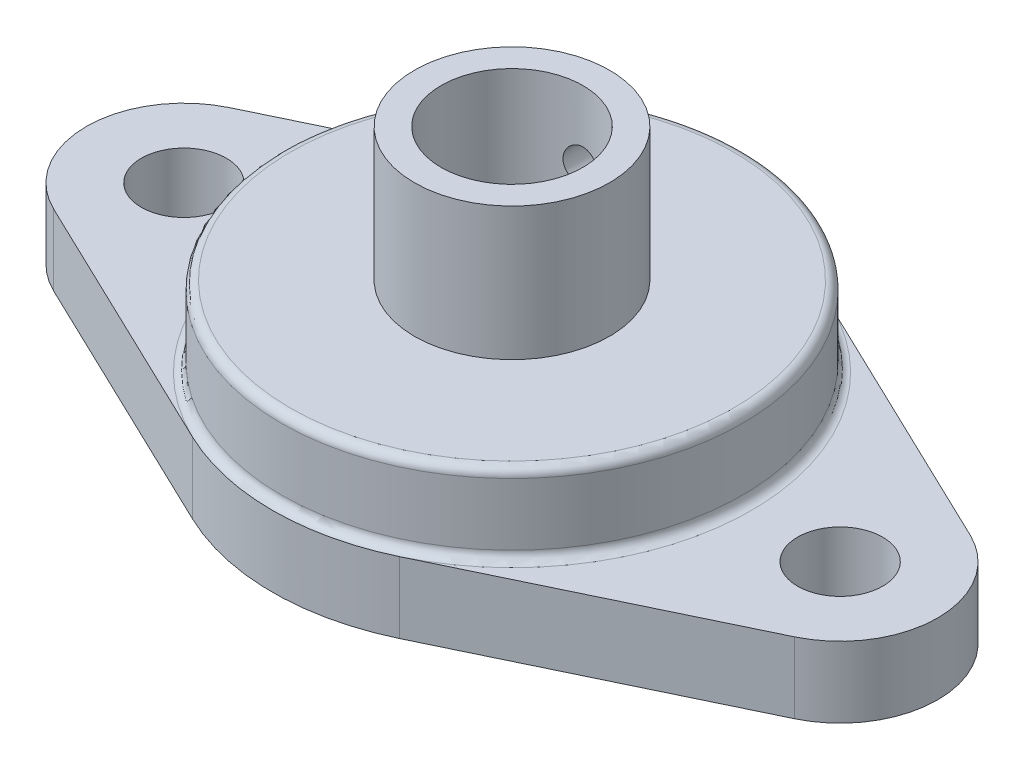
ISO-10303-21;
HEADER;
FILE_DESCRIPTION(('STEP AP214'),'2;1');
FILE_NAME('part.step','',(''),(''),'','','');
FILE_SCHEMA(('AUTOMOTIVE_DESIGN { 1 0 10303 214 1 1 1 1 }'));
ENDSEC;
DATA;
#1=APPLICATION_CONTEXT('core data for automotive mechanical design processes');
#2=APPLICATION_PROTOCOL_DEFINITION('international standard','automotive_design',2000,#1);
#3=PRODUCT_CONTEXT('',#1,'mechanical');
#4=PRODUCT('Part','Part','',(#3));
#5=PRODUCT_RELATED_PRODUCT_CATEGORY('part','',(#4));
#6=PRODUCT_DEFINITION_FORMATION('','',#4);
#7=PRODUCT_DEFINITION_CONTEXT('part definition',#1,'design');
#8=PRODUCT_DEFINITION('design','',#6,#7);
#9=PRODUCT_DEFINITION_SHAPE('','',#8);
#10=(LENGTH_UNIT() NAMED_UNIT(*) SI_UNIT(.MILLI.,.METRE.));
#11=(NAMED_UNIT(*) PLANE_ANGLE_UNIT() SI_UNIT($,.RADIAN.));
#12=(NAMED_UNIT(*) SI_UNIT($,.STERADIAN.) SOLID_ANGLE_UNIT());
#13=UNCERTAINTY_MEASURE_WITH_UNIT(LENGTH_MEASURE(1.E-05),#10,'distance_accuracy_value','');
#14=(GEOMETRIC_REPRESENTATION_CONTEXT(3) GLOBAL_UNCERTAINTY_ASSIGNED_CONTEXT((#13)) GLOBAL_UNIT_ASSIGNED_CONTEXT((#10,
#11,#12)) REPRESENTATION_CONTEXT('',''));
#15=CARTESIAN_POINT('',(0.,0.,0.));
#16=DIRECTION('',(0.,0.,1.));
#17=DIRECTION('',(1.,0.,0.));
#18=AXIS2_PLACEMENT_3D('',#15,#16,#17);
#19=CARTESIAN_POINT('',(0.,4.,0.));
#20=DIRECTION('',(0.,1.,0.));
#21=DIRECTION('',(0.,0.,1.));
#22=AXIS2_PLACEMENT_3D('',#19,#20,#21);
#23=PLANE('',#22);
#24=CARTESIAN_POINT('',(-18.5,4.,0.));
#25=DIRECTION('',(0.,1.,0.));
#26=DIRECTION('',(0.,0.,1.));
#27=AXIS2_PLACEMENT_3D('',#24,#25,#26);
#28=CIRCLE('',#27,2.4);
#29=CARTESIAN_POINT('',(-18.5,4.,2.4));
#30=VERTEX_POINT('',#29);
#31=EDGE_CURVE('E165',#30,#30,#28,.T.);
#32=ORIENTED_EDGE('',*,*,#31,.F.);
#33=EDGE_LOOP('',(#32));
#34=FACE_BOUND('',#33,.T.);
#35=DIRECTION('',(0.901666341492556,0.,0.432432432432432));
#36=VECTOR('',#35,1.);
#37=CARTESIAN_POINT('',(-5.83783783783784,4.,12.1724956101495));
#38=LINE('',#37,#36);
#39=CARTESIAN_POINT('',(-20.8783783783784,4.,4.95916487820905));
#40=VERTEX_POINT('',#39);
#41=CARTESIAN_POINT('',(-5.83783783783784,4.,12.1724956101495));
#42=VERTEX_POINT('',#41);
#43=EDGE_CURVE('E195',#40,#42,#38,.T.);
#44=ORIENTED_EDGE('',*,*,#43,.T.);
#45=CARTESIAN_POINT('',(0.,4.,0.));
#46=DIRECTION('',(0.,1.,0.));
#47=DIRECTION('',(0.,0.,1.));
#48=AXIS2_PLACEMENT_3D('',#45,#46,#47);
#49=CIRCLE('',#48,13.5);
#50=CARTESIAN_POINT('',(-5.83783783783784,4.,-12.1724956101495));
#51=VERTEX_POINT('',#50);
#52=EDGE_CURVE('E11',#42,#51,#49,.F.);
#53=ORIENTED_EDGE('',*,*,#52,.T.);
#54=DIRECTION('',(0.901666341492556,0.,-0.432432432432432));
#55=VECTOR('',#54,1.);
#56=CARTESIAN_POINT('',(-5.83783783783784,4.,-12.1724956101495));
#57=LINE('',#56,#55);
#58=CARTESIAN_POINT('',(-20.8783783783784,4.,-4.95916487820905));
#59=VERTEX_POINT('',#58);
#60=EDGE_CURVE('E201',#59,#51,#57,.T.);
#61=ORIENTED_EDGE('',*,*,#60,.F.);
#62=CARTESIAN_POINT('',(-18.5,4.,0.));
#63=DIRECTION('',(0.,1.,0.));
#64=DIRECTION('',(0.,0.,1.));
#65=AXIS2_PLACEMENT_3D('',#62,#63,#64);
#66=CIRCLE('',#65,5.5);
#67=EDGE_CURVE('E196',#59,#40,#66,.T.);
#68=ORIENTED_EDGE('',*,*,#67,.T.);
#69=EDGE_LOOP('',(#44,#53,#61,#68));
#70=FACE_BOUND('',#69,.T.);
#71=ADVANCED_FACE('F37',(#34,#70),#23,.T.);
#72=CARTESIAN_POINT('',(0.,8.5,0.));
#73=DIRECTION('',(0.,1.,0.));
#74=DIRECTION('',(0.,0.,1.));
#75=AXIS2_PLACEMENT_3D('',#72,#73,#74);
#76=PLANE('',#75);
#77=CARTESIAN_POINT('',(0.,8.5,0.));
#78=DIRECTION('',(0.,1.,0.));
#79=DIRECTION('',(0.,0.,1.));
#80=AXIS2_PLACEMENT_3D('',#77,#78,#79);
#81=CIRCLE('',#80,12.5);
#82=CARTESIAN_POINT('',(0.,8.5,12.5));
#83=VERTEX_POINT('',#82);
#84=EDGE_CURVE('E179',#83,#83,#81,.T.);
#85=ORIENTED_EDGE('',*,*,#84,.T.);
#86=EDGE_LOOP('',(#85));
#87=FACE_BOUND('',#86,.T.);
#88=CARTESIAN_POINT('',(0.,8.5,0.));
#89=DIRECTION('',(0.,1.,0.));
#90=DIRECTION('',(0.,0.,1.));
#91=AXIS2_PLACEMENT_3D('',#88,#89,#90);
#92=CIRCLE('',#91,5.5);
#93=CARTESIAN_POINT('',(0.,8.5,5.5));
#94=VERTEX_POINT('',#93);
#95=EDGE_CURVE('E205',#94,#94,#92,.T.);
#96=ORIENTED_EDGE('',*,*,#95,.F.);
#97=EDGE_LOOP('',(#96));
#98=FACE_BOUND('',#97,.T.);
#99=ADVANCED_FACE('F249',(#87,#98),#76,.T.);
#100=CARTESIAN_POINT('',(18.5,4.,0.));
#101=DIRECTION('',(0.,1.,0.));
#102=DIRECTION('',(0.,0.,1.));
#103=AXIS2_PLACEMENT_3D('',#100,#101,#102);
#104=CIRCLE('',#103,2.4);
#105=CARTESIAN_POINT('',(18.5,4.,2.4));
#106=VERTEX_POINT('',#105);
#107=EDGE_CURVE('E132',#106,#106,#104,.T.);
#108=ORIENTED_EDGE('',*,*,#107,.F.);
#109=EDGE_LOOP('',(#108));
#110=FACE_BOUND('',#109,.T.);
#111=DIRECTION('',(0.901666341492556,0.,0.432432432432432));
#112=VECTOR('',#111,1.);
#113=CARTESIAN_POINT('',(5.83783783783783,4.,-12.1724956101495));
#114=LINE('',#113,#112);
#115=CARTESIAN_POINT('',(5.83783783783784,4.,-12.1724956101495));
#116=VERTEX_POINT('',#115);
#117=CARTESIAN_POINT('',(20.8783783783784,4.,-4.95916487820906));
#118=VERTEX_POINT('',#117);
#119=EDGE_CURVE('E114',#116,#118,#114,.T.);
#120=ORIENTED_EDGE('',*,*,#119,.F.);
#121=CARTESIAN_POINT('',(0.,4.,0.));
#122=DIRECTION('',(0.,1.,0.));
#123=DIRECTION('',(0.,0.,1.));
#124=AXIS2_PLACEMENT_3D('',#121,#122,#123);
#125=CIRCLE('',#124,13.5);
#126=CARTESIAN_POINT('',(5.83783783783784,4.,12.1724956101495));
#127=VERTEX_POINT('',#126);
#128=EDGE_CURVE('E46',#116,#127,#125,.F.);
#129=ORIENTED_EDGE('',*,*,#128,.T.);
#130=DIRECTION('',(0.901666341492556,0.,-0.432432432432433));
#131=VECTOR('',#130,1.);
#132=CARTESIAN_POINT('',(5.83783783783784,4.,12.1724956101495));
#133=LINE('',#132,#131);
#134=CARTESIAN_POINT('',(20.8783783783784,4.,4.95916487820905));
#135=VERTEX_POINT('',#134);
#136=EDGE_CURVE('E116',#127,#135,#133,.T.);
#137=ORIENTED_EDGE('',*,*,#136,.T.);
#138=CARTESIAN_POINT('',(18.5,4.,0.));
#139=DIRECTION('',(0.,1.,0.));
#140=DIRECTION('',(0.,0.,1.));
#141=AXIS2_PLACEMENT_3D('',#138,#139,#140);
#142=CIRCLE('',#141,5.5);
#143=EDGE_CURVE('E110',#135,#118,#142,.T.);
#144=ORIENTED_EDGE('',*,*,#143,.T.);
#145=EDGE_LOOP('',(#120,#129,#137,#144));
#146=FACE_BOUND('',#145,.T.);
#147=ADVANCED_FACE('F112',(#110,#146),#23,.T.);
#148=CARTESIAN_POINT('',(-5.83783783783784,4.,-12.1724956101495));
#149=DIRECTION('',(-0.432432432432432,0.,-0.901666341492556));
#150=DIRECTION('',(-0.901666341492556,0.,0.432432432432432));
#151=AXIS2_PLACEMENT_3D('',#148,#149,#150);
#152=PLANE('',#151);
#153=DIRECTION('',(0.901666341492556,0.,-0.432432432432432));
#154=VECTOR('',#153,1.);
#155=CARTESIAN_POINT('',(-5.83783783783784,0.,-12.1724956101495));
#156=LINE('',#155,#154);
#157=CARTESIAN_POINT('',(-20.8783783783784,0.,-4.95916487820905));
#158=VERTEX_POINT('',#157);
#159=CARTESIAN_POINT('',(-5.83783783783784,0.,-12.1724956101495));
#160=VERTEX_POINT('',#159);
#161=EDGE_CURVE('E142',#158,#160,#156,.T.);
#162=ORIENTED_EDGE('',*,*,#161,.F.);
#163=DIRECTION('',(0.,-1.,0.));
#164=VECTOR('',#163,1.);
#165=CARTESIAN_POINT('',(-20.8783783783784,4.,-4.95916487820905));
#166=LINE('',#165,#164);
#167=EDGE_CURVE('E93',#59,#158,#166,.T.);
#168=ORIENTED_EDGE('',*,*,#167,.F.);
#169=ORIENTED_EDGE('',*,*,#60,.T.);
#170=DIRECTION('',(0.,-1.,0.));
#171=VECTOR('',#170,1.);
#172=CARTESIAN_POINT('',(-5.83783783783784,4.,-12.1724956101495));
#173=LINE('',#172,#171);
#174=EDGE_CURVE('E89',#51,#160,#173,.T.);
#175=ORIENTED_EDGE('',*,*,#174,.T.);
#176=EDGE_LOOP('',(#162,#168,#169,#175));
#177=FACE_BOUND('',#176,.T.);
#178=ADVANCED_FACE('F259',(#177),#152,.T.);
#179=CARTESIAN_POINT('',(-18.5,4.,0.));
#180=DIRECTION('',(0.,-1.,0.));
#181=DIRECTION('',(0.,0.,-1.));
#182=AXIS2_PLACEMENT_3D('',#179,#180,#181);
#183=CYLINDRICAL_SURFACE('',#182,5.5);
#184=CARTESIAN_POINT('',(-18.5,0.,0.));
#185=DIRECTION('',(0.,1.,0.));
#186=DIRECTION('',(0.,0.,1.));
#187=AXIS2_PLACEMENT_3D('',#184,#185,#186);
#188=CIRCLE('',#187,5.5);
#189=CARTESIAN_POINT('',(-20.8783783783784,0.,4.95916487820905));
#190=VERTEX_POINT('',#189);
#191=EDGE_CURVE('E146',#158,#190,#188,.T.);
#192=ORIENTED_EDGE('',*,*,#191,.T.);
#193=DIRECTION('',(0.,-1.,0.));
#194=VECTOR('',#193,1.);
#195=CARTESIAN_POINT('',(-20.8783783783784,4.,4.95916487820905));
#196=LINE('',#195,#194);
#197=EDGE_CURVE('E175',#40,#190,#196,.T.);
#198=ORIENTED_EDGE('',*,*,#197,.F.);
#199=ORIENTED_EDGE('',*,*,#67,.F.);
#200=ORIENTED_EDGE('',*,*,#167,.T.);
#201=EDGE_LOOP('',(#192,#198,#199,#200));
#202=FACE_BOUND('',#201,.T.);
#203=ADVANCED_FACE('F281',(#202),#183,.T.);
#204=CARTESIAN_POINT('',(-5.83783783783784,4.,12.1724956101495));
#205=DIRECTION('',(0.432432432432432,0.,-0.901666341492556));
#206=DIRECTION('',(-0.901666341492556,0.,-0.432432432432432));
#207=AXIS2_PLACEMENT_3D('',#204,#205,#206);
#208=PLANE('',#207);
#209=DIRECTION('',(0.901666341492556,0.,0.432432432432432));
#210=VECTOR('',#209,1.);
#211=CARTESIAN_POINT('',(-5.83783783783784,0.,12.1724956101495));
#212=LINE('',#211,#210);
#213=CARTESIAN_POINT('',(-5.83783783783784,0.,12.1724956101495));
#214=VERTEX_POINT('',#213);
#215=EDGE_CURVE('E149',#190,#214,#212,.T.);
#216=ORIENTED_EDGE('',*,*,#215,.T.);
#217=DIRECTION('',(0.,-1.,0.));
#218=VECTOR('',#217,1.);
#219=CARTESIAN_POINT('',(-5.83783783783784,4.,12.1724956101495));
#220=LINE('',#219,#218);
#221=EDGE_CURVE('E172',#42,#214,#220,.T.);
#222=ORIENTED_EDGE('',*,*,#221,.F.);
#223=ORIENTED_EDGE('',*,*,#43,.F.);
#224=ORIENTED_EDGE('',*,*,#197,.T.);
#225=EDGE_LOOP('',(#216,#222,#223,#224));
#226=FACE_BOUND('',#225,.T.);
#227=ADVANCED_FACE('F278',(#226),#208,.F.);
#228=CARTESIAN_POINT('',(0.,4.,0.));
#229=DIRECTION('',(0.,-1.,0.));
#230=DIRECTION('',(0.,0.,-1.));
#231=AXIS2_PLACEMENT_3D('',#228,#229,#230);
#232=CYLINDRICAL_SURFACE('',#231,13.5);
#233=CARTESIAN_POINT('',(0.,0.,0.));
#234=DIRECTION('',(0.,1.,0.));
#235=DIRECTION('',(0.,0.,1.));
#236=AXIS2_PLACEMENT_3D('',#233,#234,#235);
#237=CIRCLE('',#236,13.5);
#238=CARTESIAN_POINT('',(5.83783783783784,0.,12.1724956101495));
#239=VERTEX_POINT('',#238);
#240=EDGE_CURVE('E152',#214,#239,#237,.T.);
#241=ORIENTED_EDGE('',*,*,#240,.T.);
#242=DIRECTION('',(0.,-1.,0.));
#243=VECTOR('',#242,1.);
#244=CARTESIAN_POINT('',(5.83783783783784,4.,12.1724956101495));
#245=LINE('',#244,#243);
#246=EDGE_CURVE('E169',#127,#239,#245,.T.);
#247=ORIENTED_EDGE('',*,*,#246,.F.);
#248=CARTESIAN_POINT('',(0.,4.,0.));
#249=DIRECTION('',(0.,1.,0.));
#250=DIRECTION('',(0.,0.,1.));
#251=AXIS2_PLACEMENT_3D('',#248,#249,#250);
#252=CIRCLE('',#251,13.5);
#253=EDGE_CURVE('E134',#42,#127,#252,.T.);
#254=ORIENTED_EDGE('',*,*,#253,.F.);
#255=ORIENTED_EDGE('',*,*,#221,.T.);
#256=EDGE_LOOP('',(#241,#247,#254,#255));
#257=FACE_BOUND('',#256,.T.);
#258=ADVANCED_FACE('F192',(#257),#232,.T.);
#259=CARTESIAN_POINT('',(5.83783783783784,4.,12.1724956101495));
#260=DIRECTION('',(-0.432432432432433,0.,-0.901666341492556));
#261=DIRECTION('',(-0.901666341492556,0.,0.432432432432433));
#262=AXIS2_PLACEMENT_3D('',#259,#260,#261);
#263=PLANE('',#262);
#264=DIRECTION('',(0.901666341492556,0.,-0.432432432432433));
#265=VECTOR('',#264,1.);
#266=CARTESIAN_POINT('',(5.83783783783784,0.,12.1724956101495));
#267=LINE('',#266,#265);
#268=CARTESIAN_POINT('',(20.8783783783784,0.,4.95916487820905));
#269=VERTEX_POINT('',#268);
#270=EDGE_CURVE('E155',#239,#269,#267,.T.);
#271=ORIENTED_EDGE('',*,*,#270,.T.);
#272=DIRECTION('',(0.,-1.,0.));
#273=VECTOR('',#272,1.);
#274=CARTESIAN_POINT('',(20.8783783783784,4.,4.95916487820905));
#275=LINE('',#274,#273);
#276=EDGE_CURVE('E128',#135,#269,#275,.T.);
#277=ORIENTED_EDGE('',*,*,#276,.F.);
#278=ORIENTED_EDGE('',*,*,#136,.F.);
#279=ORIENTED_EDGE('',*,*,#246,.T.);
#280=EDGE_LOOP('',(#271,#277,#278,#279));
#281=FACE_BOUND('',#280,.T.);
#282=ADVANCED_FACE('F190',(#281),#263,.F.);
#283=CARTESIAN_POINT('',(18.5,4.,0.));
#284=DIRECTION('',(0.,-1.,0.));
#285=DIRECTION('',(0.,0.,-1.));
#286=AXIS2_PLACEMENT_3D('',#283,#284,#285);
#287=CYLINDRICAL_SURFACE('',#286,5.5);
#288=CARTESIAN_POINT('',(18.5,0.,0.));
#289=DIRECTION('',(0.,1.,0.));
#290=DIRECTION('',(0.,0.,1.));
#291=AXIS2_PLACEMENT_3D('',#288,#289,#290);
#292=CIRCLE('',#291,5.5);
#293=CARTESIAN_POINT('',(20.8783783783784,0.,-4.95916487820906));
#294=VERTEX_POINT('',#293);
#295=EDGE_CURVE('E124',#269,#294,#292,.T.);
#296=ORIENTED_EDGE('',*,*,#295,.T.);
#297=DIRECTION('',(0.,-1.,0.));
#298=VECTOR('',#297,1.);
#299=CARTESIAN_POINT('',(20.8783783783784,4.,-4.95916487820906));
#300=LINE('',#299,#298);
#301=EDGE_CURVE('E122',#118,#294,#300,.T.);
#302=ORIENTED_EDGE('',*,*,#301,.F.);
#303=ORIENTED_EDGE('',*,*,#143,.F.);
#304=ORIENTED_EDGE('',*,*,#276,.T.);
#305=EDGE_LOOP('',(#296,#302,#303,#304));
#306=FACE_BOUND('',#305,.T.);
#307=ADVANCED_FACE('F123',(#306),#287,.T.);
#308=CARTESIAN_POINT('',(5.83783783783783,4.,-12.1724956101495));
#309=DIRECTION('',(0.432432432432432,0.,-0.901666341492556));
#310=DIRECTION('',(-0.901666341492556,0.,-0.432432432432432));
#311=AXIS2_PLACEMENT_3D('',#308,#309,#310);
#312=PLANE('',#311);
#313=DIRECTION('',(0.901666341492556,0.,0.432432432432432));
#314=VECTOR('',#313,1.);
#315=CARTESIAN_POINT('',(5.83783783783783,0.,-12.1724956101495));
#316=LINE('',#315,#314);
#317=CARTESIAN_POINT('',(5.83783783783784,0.,-12.1724956101495));
#318=VERTEX_POINT('',#317);
#319=EDGE_CURVE('E160',#318,#294,#316,.T.);
#320=ORIENTED_EDGE('',*,*,#319,.F.);
#321=DIRECTION('',(0.,-1.,0.));
#322=VECTOR('',#321,1.);
#323=CARTESIAN_POINT('',(5.83783783783784,4.,-12.1724956101495));
#324=LINE('',#323,#322);
#325=EDGE_CURVE('E81',#116,#318,#324,.T.);
#326=ORIENTED_EDGE('',*,*,#325,.F.);
#327=ORIENTED_EDGE('',*,*,#119,.T.);
#328=ORIENTED_EDGE('',*,*,#301,.T.);
#329=EDGE_LOOP('',(#320,#326,#327,#328));
#330=FACE_BOUND('',#329,.T.);
#331=ADVANCED_FACE('F130',(#330),#312,.T.);
#332=EDGE_CURVE('E156',#318,#160,#237,.T.);
#333=ORIENTED_EDGE('',*,*,#332,.T.);
#334=ORIENTED_EDGE('',*,*,#174,.F.);
#335=EDGE_CURVE('E54',#116,#51,#252,.T.);
#336=ORIENTED_EDGE('',*,*,#335,.F.);
#337=ORIENTED_EDGE('',*,*,#325,.T.);
#338=EDGE_LOOP('',(#333,#334,#336,#337));
#339=FACE_BOUND('',#338,.T.);
#340=ADVANCED_FACE('F269',(#339),#232,.T.);
#341=CARTESIAN_POINT('',(-18.5,4.,0.));
#342=DIRECTION('',(0.,-1.,0.));
#343=DIRECTION('',(0.,0.,-1.));
#344=AXIS2_PLACEMENT_3D('',#341,#342,#343);
#345=CYLINDRICAL_SURFACE('',#344,2.4);
#346=ORIENTED_EDGE('',*,*,#31,.T.);
#347=EDGE_LOOP('',(#346));
#348=FACE_BOUND('',#347,.T.);
#349=CARTESIAN_POINT('',(-18.5,0.,0.));
#350=DIRECTION('',(0.,1.,0.));
#351=DIRECTION('',(0.,0.,1.));
#352=AXIS2_PLACEMENT_3D('',#349,#350,#351);
#353=CIRCLE('',#352,2.4);
#354=CARTESIAN_POINT('',(-18.5,0.,2.4));
#355=VERTEX_POINT('',#354);
#356=EDGE_CURVE('E139',#355,#355,#353,.T.);
#357=ORIENTED_EDGE('',*,*,#356,.F.);
#358=EDGE_LOOP('',(#357));
#359=FACE_BOUND('',#358,.T.);
#360=ADVANCED_FACE('F267',(#348,#359),#345,.F.);
#361=CARTESIAN_POINT('',(18.5,4.,0.));
#362=DIRECTION('',(0.,-1.,0.));
#363=DIRECTION('',(0.,0.,-1.));
#364=AXIS2_PLACEMENT_3D('',#361,#362,#363);
#365=CYLINDRICAL_SURFACE('',#364,2.4);
#366=ORIENTED_EDGE('',*,*,#107,.T.);
#367=EDGE_LOOP('',(#366));
#368=FACE_BOUND('',#367,.T.);
#369=CARTESIAN_POINT('',(18.5,0.,0.));
#370=DIRECTION('',(0.,1.,0.));
#371=DIRECTION('',(0.,0.,1.));
#372=AXIS2_PLACEMENT_3D('',#369,#370,#371);
#373=CIRCLE('',#372,2.4);
#374=CARTESIAN_POINT('',(18.5,0.,2.4));
#375=VERTEX_POINT('',#374);
#376=EDGE_CURVE('E162',#375,#375,#373,.T.);
#377=ORIENTED_EDGE('',*,*,#376,.F.);
#378=EDGE_LOOP('',(#377));
#379=FACE_BOUND('',#378,.T.);
#380=ADVANCED_FACE('F263',(#368,#379),#365,.F.);
#381=CARTESIAN_POINT('',(0.,0.,0.));
#382=DIRECTION('',(0.,1.,0.));
#383=DIRECTION('',(0.,0.,1.));
#384=AXIS2_PLACEMENT_3D('',#381,#382,#383);
#385=PLANE('',#384);
#386=CARTESIAN_POINT('',(0.,0.,0.));
#387=DIRECTION('',(0.,1.,0.));
#388=DIRECTION('',(0.,0.,1.));
#389=AXIS2_PLACEMENT_3D('',#386,#387,#388);
#390=CIRCLE('',#389,4.);
#391=CARTESIAN_POINT('',(0.,0.,4.));
#392=VERTEX_POINT('',#391);
#393=EDGE_CURVE('E208',#392,#392,#390,.F.);
#394=ORIENTED_EDGE('',*,*,#393,.F.);
#395=EDGE_LOOP('',(#394));
#396=FACE_BOUND('',#395,.T.);
#397=ORIENTED_EDGE('',*,*,#356,.T.);
#398=EDGE_LOOP('',(#397));
#399=FACE_BOUND('',#398,.T.);
#400=ORIENTED_EDGE('',*,*,#161,.T.);
#401=ORIENTED_EDGE('',*,*,#332,.F.);
#402=ORIENTED_EDGE('',*,*,#319,.T.);
#403=ORIENTED_EDGE('',*,*,#295,.F.);
#404=ORIENTED_EDGE('',*,*,#270,.F.);
#405=ORIENTED_EDGE('',*,*,#240,.F.);
#406=ORIENTED_EDGE('',*,*,#215,.F.);
#407=ORIENTED_EDGE('',*,*,#191,.F.);
#408=EDGE_LOOP('',(#400,#401,#402,#403,#404,#405,#406,#407));
#409=FACE_BOUND('',#408,.T.);
#410=ORIENTED_EDGE('',*,*,#376,.T.);
#411=EDGE_LOOP('',(#410));
#412=FACE_BOUND('',#411,.T.);
#413=ADVANCED_FACE('F255',(#396,#399,#409,#412),#385,.F.);
#414=CARTESIAN_POINT('',(0.,8.5,0.));
#415=DIRECTION('',(0.,-1.,0.));
#416=DIRECTION('',(0.,0.,-1.));
#417=AXIS2_PLACEMENT_3D('',#414,#415,#416);
#418=CYLINDRICAL_SURFACE('',#417,13.);
#419=CARTESIAN_POINT('',(0.,8.,0.));
#420=DIRECTION('',(0.,1.,0.));
#421=DIRECTION('',(0.,0.,1.));
#422=AXIS2_PLACEMENT_3D('',#419,#420,#421);
#423=CIRCLE('',#422,13.);
#424=CARTESIAN_POINT('',(0.,8.,13.));
#425=VERTEX_POINT('',#424);
#426=EDGE_CURVE('E185',#425,#425,#423,.F.);
#427=ORIENTED_EDGE('',*,*,#426,.T.);
#428=EDGE_LOOP('',(#427));
#429=FACE_BOUND('',#428,.T.);
#430=CARTESIAN_POINT('',(0.,4.5,0.));
#431=DIRECTION('',(0.,1.,0.));
#432=DIRECTION('',(0.,0.,1.));
#433=AXIS2_PLACEMENT_3D('',#430,#431,#432);
#434=CIRCLE('',#433,13.);
#435=CARTESIAN_POINT('',(0.,4.5,13.));
#436=VERTEX_POINT('',#435);
#437=EDGE_CURVE('E182',#436,#436,#434,.T.);
#438=ORIENTED_EDGE('',*,*,#437,.T.);
#439=EDGE_LOOP('',(#438));
#440=FACE_BOUND('',#439,.T.);
#441=ADVANCED_FACE('F247',(#429,#440),#418,.T.);
#442=CARTESIAN_POINT('',(0.,16.,0.));
#443=DIRECTION('',(0.,-1.,0.));
#444=DIRECTION('',(0.,0.,-1.));
#445=AXIS2_PLACEMENT_3D('',#442,#443,#444);
#446=CYLINDRICAL_SURFACE('',#445,5.5);
#447=CARTESIAN_POINT('',(1.,12.,-5.40832691319598));
#448=CARTESIAN_POINT('',(0.999997833744767,11.9443299387211,-5.40832797364528));
#449=CARTESIAN_POINT('',(0.995335502119675,11.8886314043782,-5.40919579392021));
#450=CARTESIAN_POINT('',(0.976820659835412,11.778802692084,-5.41256931618596));
#451=CARTESIAN_POINT('',(0.962960160510876,11.7246739201694,-5.41507644189578));
#452=CARTESIAN_POINT('',(0.926486846446966,11.6195898434835,-5.4214354513315));
#453=CARTESIAN_POINT('',(0.903881945963433,11.568631717344,-5.42528611875607));
#454=CARTESIAN_POINT('',(0.850582127042014,11.4712350541875,-5.43389689920319));
#455=CARTESIAN_POINT('',(0.819887918635019,11.4247961209923,-5.438656932397));
#456=CARTESIAN_POINT('',(0.750897624119711,11.3372082762786,-5.4486123689521));
#457=CARTESIAN_POINT('',(0.712525176739021,11.2961199628829,-5.45381181531897));
#458=CARTESIAN_POINT('',(0.62943269817084,11.2209272185829,-5.46402446588599));
#459=CARTESIAN_POINT('',(0.584712262381758,11.1868232331773,-5.46903765818916));
#460=CARTESIAN_POINT('',(0.489796709499925,11.1263363407748,-5.47835611996116));
#461=CARTESIAN_POINT('',(0.439564745239941,11.1000103650021,-5.48265607320122));
#462=CARTESIAN_POINT('',(0.335299887218807,11.0561933334869,-5.49001838668285));
#463=CARTESIAN_POINT('',(0.28126728766334,11.0387015947453,-5.49308084259509));
#464=CARTESIAN_POINT('',(0.171562418910429,11.0132363833723,-5.49759455294158));
#465=CARTESIAN_POINT('',(0.115914564259384,11.0051608428396,-5.49906307272621));
#466=CARTESIAN_POINT('',(0.00403573648296246,10.9984394162688,-5.50028290444734));
#467=CARTESIAN_POINT('',(-0.0521951894675191,10.9997927732142,-5.50003435424197));
#468=CARTESIAN_POINT('',(-0.16294459807037,11.011812071039,-5.49786159276056));
#469=CARTESIAN_POINT('',(-0.217475450026675,11.0223681267572,-5.49595715438454));
#470=CARTESIAN_POINT('',(-0.323978745301683,11.0523195987308,-5.49070873453988));
#471=CARTESIAN_POINT('',(-0.375951099489801,11.0717153226931,-5.48736470295951));
#472=CARTESIAN_POINT('',(-0.476183112726923,11.1189015298896,-5.47957960186178));
#473=CARTESIAN_POINT('',(-0.524421446258733,11.1467363220169,-5.47513276511691));
#474=CARTESIAN_POINT('',(-0.615583816786463,11.2099779449623,-5.46563448410861));
#475=CARTESIAN_POINT('',(-0.65850734384911,11.2453855014677,-5.4605829819214));
#476=CARTESIAN_POINT('',(-0.738472225271972,11.3233742272896,-5.4503495404642));
#477=CARTESIAN_POINT('',(-0.775419797024746,11.3660515089595,-5.44516677076057));
#478=CARTESIAN_POINT('',(-0.84164635982083,11.4570470319605,-5.4353248103429));
#479=CARTESIAN_POINT('',(-0.870925251484836,11.5053653463826,-5.43066562641452));
#480=CARTESIAN_POINT('',(-0.921007691245463,11.6063912552434,-5.42239736704917));
#481=CARTESIAN_POINT('',(-0.941798276926112,11.6591054158199,-5.41878990006368));
#482=CARTESIAN_POINT('',(-0.97420188443499,11.7673587249442,-5.41305866738468));
#483=CARTESIAN_POINT('',(-0.985815879483378,11.8228975732556,-5.41093474435718));
#484=CARTESIAN_POINT('',(-0.99940108925773,11.9343799006027,-5.40844202046372));
#485=CARTESIAN_POINT('',(-1.00150674244582,11.9903064663348,-5.40804875191389));
#486=CARTESIAN_POINT('',(-0.996375273894248,12.1017122752805,-5.40899647576945));
#487=CARTESIAN_POINT('',(-0.989138585178943,12.157191539107,-5.41033738779432));
#488=CARTESIAN_POINT('',(-0.965643048194486,12.2656901720261,-5.41457964689337));
#489=CARTESIAN_POINT('',(-0.94945409427688,12.318725192004,-5.41746890003943));
#490=CARTESIAN_POINT('',(-0.908587487859389,12.4213298594142,-5.42447195400378));
#491=CARTESIAN_POINT('',(-0.88390924253054,12.4708992645428,-5.42858584033864));
#492=CARTESIAN_POINT('',(-0.826452930939969,12.5657595980076,-5.43763067076332));
#493=CARTESIAN_POINT('',(-0.793589589707833,12.6109980590422,-5.44257002421489));
#494=CARTESIAN_POINT('',(-0.720811524753681,12.6953668457989,-5.45268533146011));
#495=CARTESIAN_POINT('',(-0.680896206506622,12.7344966559998,-5.45786130517501));
#496=CARTESIAN_POINT('',(-0.594548150036306,12.8060364230749,-5.46794493022657));
#497=CARTESIAN_POINT('',(-0.548040116261882,12.8383561776809,-5.47284841413378));
#498=CARTESIAN_POINT('',(-0.450176309896763,12.8947231530415,-5.48176540688883));
#499=CARTESIAN_POINT('',(-0.398820716033923,12.9187706786386,-5.48577894853028));
#500=CARTESIAN_POINT('',(-0.29297410917267,12.9577740193182,-5.49244586315787));
#501=CARTESIAN_POINT('',(-0.238500164676974,12.9727749524383,-5.49510597552399));
#502=CARTESIAN_POINT('',(-0.127753324481739,12.9934036716486,-5.49879498739045));
#503=CARTESIAN_POINT('',(-0.0714806068396161,12.9990323825684,-5.49982404783879));
#504=CARTESIAN_POINT('',(0.0403998095144113,13.0007262605528,-5.50013207106945));
#505=CARTESIAN_POINT('',(0.0960054189627314,12.9969279442423,-5.49943601615581));
#506=CARTESIAN_POINT('',(0.205772269495427,12.980173526788,-5.49642366951049));
#507=CARTESIAN_POINT('',(0.259933522681888,12.9672175024005,-5.4941073913589));
#508=CARTESIAN_POINT('',(0.365207716720243,12.9325715482553,-5.48811453453941));
#509=CARTESIAN_POINT('',(0.416325298323198,12.910895327312,-5.48444009174284));
#510=CARTESIAN_POINT('',(0.514218505970989,12.8594402985958,-5.47612961195727));
#511=CARTESIAN_POINT('',(0.560993864398312,12.829660991862,-5.47149351575705));
#512=CARTESIAN_POINT('',(0.64955729876811,12.7623711807184,-5.46169295104726));
#513=CARTESIAN_POINT('',(0.691269449293619,12.7247616523052,-5.45652218977741));
#514=CARTESIAN_POINT('',(0.767838111774054,12.6430852416558,-5.44627585142043));
#515=CARTESIAN_POINT('',(0.802693012176555,12.5990168457289,-5.44120029696122));
#516=CARTESIAN_POINT('',(0.864838359022299,12.5052201621911,-5.43167141434991));
#517=CARTESIAN_POINT('',(0.892061042527094,12.4554463803106,-5.42722382409738));
#518=CARTESIAN_POINT('',(0.937715294552638,12.3519683616029,-5.41952308783751));
#519=CARTESIAN_POINT('',(0.956155299818062,12.2982679541869,-5.41626879622786));
#520=CARTESIAN_POINT('',(0.979899481024946,12.2036616577891,-5.41201405367095));
#521=CARTESIAN_POINT('',(0.987424495948278,12.1633153686977,-5.4106394360599));
#522=CARTESIAN_POINT('',(0.997475492125672,12.0819845239819,-5.40879548637076));
#523=CARTESIAN_POINT('',(1.00000159540744,12.0409999839622,-5.40832613219443));
#524=CARTESIAN_POINT('',(1.,12.,-5.40832691319598));
#525=B_SPLINE_CURVE_WITH_KNOTS('',3,(#447,#448,#449,#450,#451,#452,#453,#454,#455,#456,#457,
#458,#459,#460,#461,#462,#463,#464,#465,#466,#467,#468,#469,#470,#471,#472,#473,#474,#475,#476,
#477,#478,#479,#480,#481,#482,#483,#484,#485,#486,#487,#488,#489,#490,#491,#492,#493,#494,#495,
#496,#497,#498,#499,#500,#501,#502,#503,#504,#505,#506,#507,#508,#509,#510,#511,#512,#513,#514,
#515,#516,#517,#518,#519,#520,#521,#522,#523,#524),.UNSPECIFIED.,.T.,.F.,(4,2,2,2,2,2,2,2,2,2,2,
2,2,2,2,2,2,2,2,2,2,2,2,2,2,2,2,2,2,2,2,2,2,2,2,2,2,2,4),(0.,0.166860176303695,
0.333865461691934,0.500719948670009,0.667559795037681,0.836149675555553,1.00475030631164,
1.17455606253914,1.34434868860495,1.51228319705907,1.68020422273791,1.84614722644409,
2.01209600703444,2.17893164241915,2.34578327259646,2.51504175421998,2.68430242917503,
2.85382062241291,3.0233208350432,3.19041682321415,3.35750506664222,3.52330682829014,
3.68912017065095,3.85673910114988,4.02437216970492,4.19410261282723,4.36382680048964,
4.5326973683561,4.70155127147238,4.86797423941392,5.03439581247915,5.20055677418129,
5.36672796983505,5.53514439851506,5.70360036032117,5.87350774145283,6.04325157670206,
6.1661440507261,6.28903352480284),.UNSPECIFIED.);
#526=CARTESIAN_POINT('',(1.,12.,-5.40832691319598));
#527=VERTEX_POINT('',#526);
#528=EDGE_CURVE('E216',#527,#527,#525,.T.);
#529=ORIENTED_EDGE('',*,*,#528,.F.);
#530=EDGE_LOOP('',(#529));
#531=FACE_BOUND('',#530,.T.);
#532=CARTESIAN_POINT('',(0.,16.,0.));
#533=DIRECTION('',(0.,1.,0.));
#534=DIRECTION('',(0.,0.,1.));
#535=AXIS2_PLACEMENT_3D('',#532,#533,#534);
#536=CIRCLE('',#535,5.5);
#537=CARTESIAN_POINT('',(0.,16.,5.5));
#538=VERTEX_POINT('',#537);
#539=EDGE_CURVE('E143',#538,#538,#536,.T.);
#540=ORIENTED_EDGE('',*,*,#539,.F.);
#541=EDGE_LOOP('',(#540));
#542=FACE_BOUND('',#541,.T.);
#543=ORIENTED_EDGE('',*,*,#95,.T.);
#544=EDGE_LOOP('',(#543));
#545=FACE_BOUND('',#544,.T.);
#546=ADVANCED_FACE('F243',(#531,#542,#545),#446,.T.);
#547=CARTESIAN_POINT('',(0.,16.,0.));
#548=DIRECTION('',(0.,1.,0.));
#549=DIRECTION('',(0.,0.,1.));
#550=AXIS2_PLACEMENT_3D('',#547,#548,#549);
#551=PLANE('',#550);
#552=CARTESIAN_POINT('',(0.,16.,0.));
#553=DIRECTION('',(0.,1.,0.));
#554=DIRECTION('',(0.,0.,1.));
#555=AXIS2_PLACEMENT_3D('',#552,#553,#554);
#556=CIRCLE('',#555,4.);
#557=CARTESIAN_POINT('',(0.,16.,4.));
#558=VERTEX_POINT('',#557);
#559=EDGE_CURVE('E213',#558,#558,#556,.T.);
#560=ORIENTED_EDGE('',*,*,#559,.F.);
#561=EDGE_LOOP('',(#560));
#562=FACE_BOUND('',#561,.T.);
#563=ORIENTED_EDGE('',*,*,#539,.T.);
#564=EDGE_LOOP('',(#563));
#565=FACE_BOUND('',#564,.T.);
#566=ADVANCED_FACE('F239',(#562,#565),#551,.T.);
#567=CARTESIAN_POINT('',(0.,-0.001000000000001,0.));
#568=DIRECTION('',(0.,1.,0.));
#569=DIRECTION('',(0.,0.,1.));
#570=AXIS2_PLACEMENT_3D('',#567,#568,#569);
#571=CYLINDRICAL_SURFACE('',#570,4.);
#572=CARTESIAN_POINT('',(1.,12.,-3.87298334620742));
#573=CARTESIAN_POINT('',(0.9999984314387,12.0552203003568,-3.87298440057185));
#574=CARTESIAN_POINT('',(0.99541049820807,12.1104579594314,-3.87417722499278));
#575=CARTESIAN_POINT('',(0.977209250194447,12.2193470312326,-3.87880744892249));
#576=CARTESIAN_POINT('',(0.963590682698078,12.27299750178,-3.8822461547418));
#577=CARTESIAN_POINT('',(0.927796479849635,12.3771214152878,-3.89095489813012));
#578=CARTESIAN_POINT('',(0.905631891140944,12.4275988621578,-3.8962225706936));
#579=CARTESIAN_POINT('',(0.853408456505407,12.5241243410125,-3.90799276818327));
#580=CARTESIAN_POINT('',(0.823349275424505,12.5701721848311,-3.91449534553241));
#581=CARTESIAN_POINT('',(0.755483370924518,12.6575446581058,-3.92816286540368));
#582=CARTESIAN_POINT('',(0.717534755081557,12.6987574401403,-3.93533839048709));
#583=CARTESIAN_POINT('',(0.635272825640328,12.7743045577439,-3.94945150206622));
#584=CARTESIAN_POINT('',(0.590958917672139,12.8086382502486,-3.95638906626691));
#585=CARTESIAN_POINT('',(0.496458080431564,12.8699101870526,-3.96936166208095));
#586=CARTESIAN_POINT('',(0.446197830478043,12.8967385552646,-3.975382749602));
#587=CARTESIAN_POINT('',(0.341705273717109,12.9415238576612,-3.9857232477043));
#588=CARTESIAN_POINT('',(0.287473554316777,12.9594821007662,-3.99004290933747));
#589=CARTESIAN_POINT('',(0.177743503501663,12.9856591338314,-3.99641903539262));
#590=CARTESIAN_POINT('',(0.122293087819589,12.9940678577306,-3.99851957537723));
#591=CARTESIAN_POINT('',(0.0107315277051072,13.0015033517102,-4.00037437642922));
#592=CARTESIAN_POINT('',(-0.0453795178152282,13.0005315088838,-4.00012898438682));
#593=CARTESIAN_POINT('',(-0.155352247172388,12.9893700598999,-3.99735237981413));
#594=CARTESIAN_POINT('',(-0.209236215601068,12.9793854699785,-3.99487200936349));
#595=CARTESIAN_POINT('',(-0.314538247413687,12.9508114919806,-3.98796334609942));
#596=CARTESIAN_POINT('',(-0.365956179370439,12.932221645849,-3.98353494959376));
#597=CARTESIAN_POINT('',(-0.465406703501808,12.8867989717252,-3.97315003880358));
#598=CARTESIAN_POINT('',(-0.513404509766506,12.8598931821353,-3.96718007878021));
#599=CARTESIAN_POINT('',(-0.60427562234049,12.7986577283535,-3.9543596152386));
#600=CARTESIAN_POINT('',(-0.647148035085506,12.7643267725758,-3.94750895860996));
#601=CARTESIAN_POINT('',(-0.727774035084957,12.6881165032071,-3.93345485507808));
#602=CARTESIAN_POINT('',(-0.7653576790752,12.6460580430609,-3.92624687810367));
#603=CARTESIAN_POINT('',(-0.832976375963019,12.5561600105839,-3.91246017406683));
#604=CARTESIAN_POINT('',(-0.863011076046017,12.5083201682036,-3.90588147642388));
#605=CARTESIAN_POINT('',(-0.914788129022598,12.4078839863404,-3.89408198732659));
#606=CARTESIAN_POINT('',(-0.936489566970491,12.3552657078747,-3.88886793490288));
#607=CARTESIAN_POINT('',(-0.970685620636341,12.2469658127694,-3.88047456055983));
#608=CARTESIAN_POINT('',(-0.98318220655291,12.1912848544067,-3.87729480324087));
#609=CARTESIAN_POINT('',(-0.998331855466071,12.0800161993908,-3.87342142415656));
#610=CARTESIAN_POINT('',(-1.00123618956785,12.0244648826681,-3.87266435637459));
#611=CARTESIAN_POINT('',(-0.997806796206219,11.9136712253687,-3.87354937392416));
#612=CARTESIAN_POINT('',(-0.99147391913952,11.8584288568195,-3.87519123840506));
#613=CARTESIAN_POINT('',(-0.969970185575065,11.7507542940181,-3.88062832781824));
#614=CARTESIAN_POINT('',(-0.954945627312699,11.6982909093717,-3.8843878809375));
#615=CARTESIAN_POINT('',(-0.916647232668249,11.5966274168593,-3.89360287308385));
#616=CARTESIAN_POINT('',(-0.893372419085018,11.5474276963779,-3.89905851299445));
#617=CARTESIAN_POINT('',(-0.838708267174623,11.4526234888531,-3.91118454837305));
#618=CARTESIAN_POINT('',(-0.807168701534252,11.4071084639828,-3.91787667442657));
#619=CARTESIAN_POINT('',(-0.737060292934456,11.3219246548795,-3.93166833228686));
#620=CARTESIAN_POINT('',(-0.698490294805439,11.28225683334,-3.93876793091388));
#621=CARTESIAN_POINT('',(-0.614262720984724,11.2088755829716,-3.95278961212643));
#622=CARTESIAN_POINT('',(-0.568451952531592,11.1753359749805,-3.95970280824734));
#623=CARTESIAN_POINT('',(-0.471702682694674,11.1164256532195,-3.97238886645494));
#624=CARTESIAN_POINT('',(-0.42076444895759,11.0910545133567,-3.97816178801584));
#625=CARTESIAN_POINT('',(-0.315558201731089,11.0494215861888,-3.98788046295326));
#626=CARTESIAN_POINT('',(-0.26131738102788,11.0330942862484,-3.99183932008964));
#627=CARTESIAN_POINT('',(-0.150749760318806,11.0098158661566,-3.99754117358315));
#628=CARTESIAN_POINT('',(-0.0944233650412421,11.0028629365044,-3.99928459757363));
#629=CARTESIAN_POINT('',(0.0170835264433277,10.9986324104245,-4.00034169408811));
#630=CARTESIAN_POINT('',(0.0722538269660343,11.0010982909046,-3.99971978880008));
#631=CARTESIAN_POINT('',(0.181367496414741,11.0150478272943,-3.99625896457423));
#632=CARTESIAN_POINT('',(0.235310901780888,11.0265312150131,-3.99342011157094));
#633=CARTESIAN_POINT('',(0.340171035644817,11.0580522197709,-3.98585432853963));
#634=CARTESIAN_POINT('',(0.39110249458102,11.0780434533146,-3.98113764502668));
#635=CARTESIAN_POINT('',(0.488917053041469,11.1259705790193,-3.97031288913382));
#636=CARTESIAN_POINT('',(0.535799641265052,11.1539074726696,-3.96420464137727));
#637=CARTESIAN_POINT('',(0.625401928423901,11.2177152339971,-3.95107249681342));
#638=CARTESIAN_POINT('',(0.667994988300587,11.2537601429074,-3.94403016945647));
#639=CARTESIAN_POINT('',(0.746615020271252,11.3324228519738,-3.92990649053207));
#640=CARTESIAN_POINT('',(0.782640325068178,11.3750423160979,-3.92282512952424));
#641=CARTESIAN_POINT('',(0.84776202647924,11.4666014142013,-3.90927475860682));
#642=CARTESIAN_POINT('',(0.876716619446594,11.5156441234125,-3.90281963730391));
#643=CARTESIAN_POINT('',(0.925926896615623,11.6180554899228,-3.8914395555011));
#644=CARTESIAN_POINT('',(0.946188909759557,11.6714209661073,-3.88651348244814));
#645=CARTESIAN_POINT('',(0.974422528565572,11.7705770118263,-3.87951908741315));
#646=CARTESIAN_POINT('',(0.983993170595829,11.8158931643824,-3.87708663005761));
#647=CARTESIAN_POINT('',(0.99678229257282,11.9074688690015,-3.87381838580358));
#648=CARTESIAN_POINT('',(1.00000131437052,11.9537283402506,-3.87298246270639));
#649=CARTESIAN_POINT('',(1.,12.,-3.87298334620742));
#650=B_SPLINE_CURVE_WITH_KNOTS('',3,(#572,#573,#574,#575,#576,#577,#578,#579,#580,#581,#582,
#583,#584,#585,#586,#587,#588,#589,#590,#591,#592,#593,#594,#595,#596,#597,#598,#599,#600,#601,
#602,#603,#604,#605,#606,#607,#608,#609,#610,#611,#612,#613,#614,#615,#616,#617,#618,#619,#620,
#621,#622,#623,#624,#625,#626,#627,#628,#629,#630,#631,#632,#633,#634,#635,#636,#637,#638,#639,
#640,#641,#642,#643,#644,#645,#646,#647,#648,#649),.UNSPECIFIED.,.T.,.F.,(4,2,2,2,2,2,2,2,2,2,2,
2,2,2,2,2,2,2,2,2,2,2,2,2,2,2,2,2,2,2,2,2,2,2,2,2,2,2,4),(0.,0.165490976675229,
0.331078296534212,0.496452290829155,0.661833306984659,0.830495816734649,0.999174085882212,
1.17020598555443,1.34121263935111,1.50875500394413,1.67627259462683,1.84007305071853,
2.00388222686189,2.16917149698053,2.3344895418384,2.50428186625039,2.67408212476196,
2.84470572799636,3.01529280048094,3.18137429900961,3.34744050869795,3.51078961999957,
3.67415808564842,3.84073138339938,4.00733207550293,4.17810132382402,4.34886166284096,
4.51836829119047,4.6878421955989,4.85273378447257,5.01762046947067,5.18161950620159,
5.34563922291504,5.51358838629103,5.68158012622478,5.85270590910146,6.02370688542923,
6.16239130867207,6.30106390036083),.UNSPECIFIED.);
#651=CARTESIAN_POINT('',(1.,12.,-3.87298334620742));
#652=VERTEX_POINT('',#651);
#653=EDGE_CURVE('E223',#652,#652,#650,.T.);
#654=ORIENTED_EDGE('',*,*,#653,.F.);
#655=EDGE_LOOP('',(#654));
#656=FACE_BOUND('',#655,.T.);
#657=ORIENTED_EDGE('',*,*,#559,.T.);
#658=EDGE_LOOP('',(#657));
#659=FACE_BOUND('',#658,.T.);
#660=ORIENTED_EDGE('',*,*,#393,.T.);
#661=EDGE_LOOP('',(#660));
#662=FACE_BOUND('',#661,.T.);
#663=ADVANCED_FACE('F234',(#656,#659,#662),#571,.F.);
#664=CARTESIAN_POINT('',(0.,8.,0.));
#665=DIRECTION('',(0.,1.,0.));
#666=DIRECTION('',(0.,0.,1.));
#667=AXIS2_PLACEMENT_3D('',#664,#665,#666);
#668=TOROIDAL_SURFACE('',#667,12.5,0.5);
#669=ORIENTED_EDGE('',*,*,#426,.F.);
#670=EDGE_LOOP('',(#669));
#671=FACE_BOUND('',#670,.T.);
#672=ORIENTED_EDGE('',*,*,#84,.F.);
#673=EDGE_LOOP('',(#672));
#674=FACE_BOUND('',#673,.T.);
#675=ADVANCED_FACE('F238',(#671,#674),#668,.T.);
#676=CARTESIAN_POINT('',(0.,4.5,0.));
#677=DIRECTION('',(0.,1.,0.));
#678=DIRECTION('',(0.,0.,1.));
#679=AXIS2_PLACEMENT_3D('',#676,#677,#678);
#680=TOROIDAL_SURFACE('',#679,13.5,0.5);
#681=ORIENTED_EDGE('',*,*,#335,.T.);
#682=ORIENTED_EDGE('',*,*,#52,.F.);
#683=ORIENTED_EDGE('',*,*,#253,.T.);
#684=ORIENTED_EDGE('',*,*,#128,.F.);
#685=EDGE_LOOP('',(#681,#682,#683,#684));
#686=FACE_BOUND('',#685,.T.);
#687=ORIENTED_EDGE('',*,*,#437,.F.);
#688=EDGE_LOOP('',(#687));
#689=FACE_BOUND('',#688,.T.);
#690=ADVANCED_FACE('F39',(#686,#689),#680,.F.);
#691=CARTESIAN_POINT('',(0.,12.,-13.501));
#692=DIRECTION('',(0.,0.,1.));
#693=DIRECTION('',(1.,0.,0.));
#694=AXIS2_PLACEMENT_3D('',#691,#692,#693);
#695=CYLINDRICAL_SURFACE('',#694,1.);
#696=ORIENTED_EDGE('',*,*,#653,.T.);
#697=EDGE_LOOP('',(#696));
#698=FACE_BOUND('',#697,.T.);
#699=ORIENTED_EDGE('',*,*,#528,.T.);
#700=EDGE_LOOP('',(#699));
#701=FACE_BOUND('',#700,.T.);
#702=ADVANCED_FACE('F227',(#698,#701),#695,.F.);
#703=CLOSED_SHELL('',(#71,#99,#147,#178,#203,#227,#258,#282,#307,#331,#340,#360,#380,#413,#441,
#546,#566,#663,#675,#690,#702));
#704=MANIFOLD_SOLID_BREP('B2',#703);
#705=ADVANCED_BREP_SHAPE_REPRESENTATION('',(#18,#704),#14);
#706=SHAPE_DEFINITION_REPRESENTATION(#9,#705);
ENDSEC;
END-ISO-10303-21;
